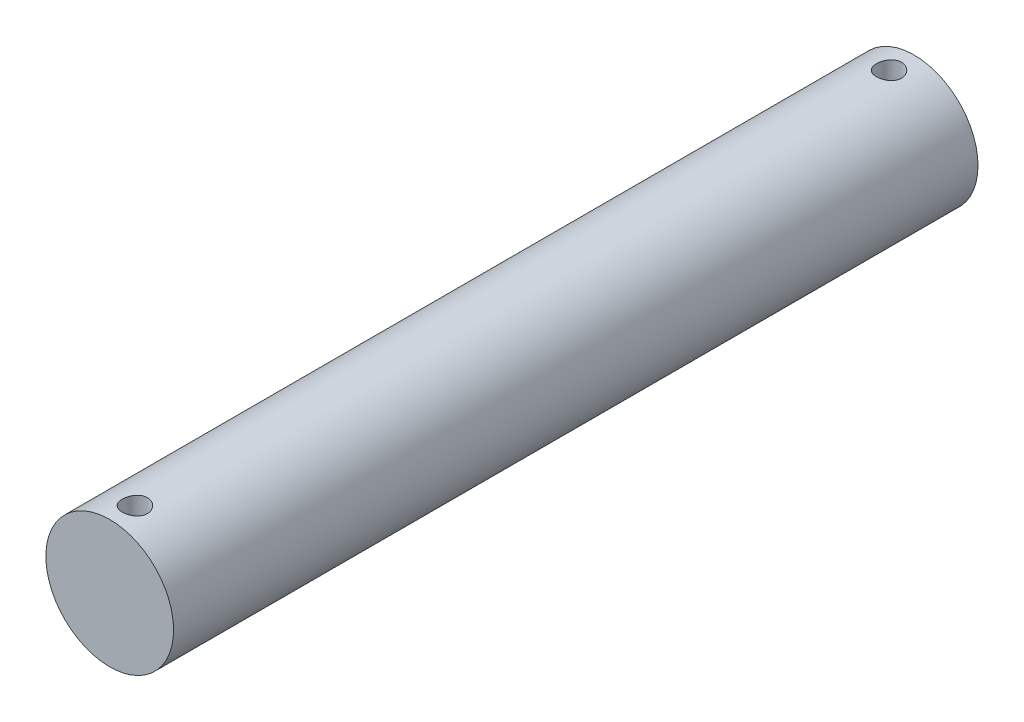
ISO-10303-21;
HEADER;
FILE_DESCRIPTION(('STEP AP214'),'2;1');
FILE_NAME('part.step','',(''),(''),'','','');
FILE_SCHEMA(('AUTOMOTIVE_DESIGN { 1 0 10303 214 1 1 1 1 }'));
ENDSEC;
DATA;
#1=APPLICATION_CONTEXT('core data for automotive mechanical design processes');
#2=APPLICATION_PROTOCOL_DEFINITION('international standard','automotive_design',2000,#1);
#3=PRODUCT_CONTEXT('',#1,'mechanical');
#4=PRODUCT('Part','Part','',(#3));
#5=PRODUCT_RELATED_PRODUCT_CATEGORY('part','',(#4));
#6=PRODUCT_DEFINITION_FORMATION('','',#4);
#7=PRODUCT_DEFINITION_CONTEXT('part definition',#1,'design');
#8=PRODUCT_DEFINITION('design','',#6,#7);
#9=PRODUCT_DEFINITION_SHAPE('','',#8);
#10=(LENGTH_UNIT() NAMED_UNIT(*) SI_UNIT(.MILLI.,.METRE.));
#11=(NAMED_UNIT(*) PLANE_ANGLE_UNIT() SI_UNIT($,.RADIAN.));
#12=(NAMED_UNIT(*) SI_UNIT($,.STERADIAN.) SOLID_ANGLE_UNIT());
#13=UNCERTAINTY_MEASURE_WITH_UNIT(LENGTH_MEASURE(1.E-05),#10,'distance_accuracy_value','');
#14=(GEOMETRIC_REPRESENTATION_CONTEXT(3) GLOBAL_UNCERTAINTY_ASSIGNED_CONTEXT((#13)) GLOBAL_UNIT_ASSIGNED_CONTEXT((#10,
#11,#12)) REPRESENTATION_CONTEXT('',''));
#15=CARTESIAN_POINT('',(0.,0.,0.));
#16=DIRECTION('',(0.,0.,1.));
#17=DIRECTION('',(1.,0.,0.));
#18=AXIS2_PLACEMENT_3D('',#15,#16,#17);
#19=CARTESIAN_POINT('',(0.,0.,40.));
#20=DIRECTION('',(0.,0.,-1.));
#21=DIRECTION('',(-1.,0.,0.));
#22=AXIS2_PLACEMENT_3D('',#19,#20,#21);
#23=CYLINDRICAL_SURFACE('',#22,6.35);
#24=CARTESIAN_POINT('',(0.,-6.35,-36.25));
#25=CARTESIAN_POINT('',(0.0694939804326168,-6.34999872344055,-36.2500025830285));
#26=CARTESIAN_POINT('',(0.139020856807098,-6.34884746695947,-36.2558148776677));
#27=CARTESIAN_POINT('',(0.276110920333324,-6.34436590183971,-36.2788929251196));
#28=CARTESIAN_POINT('',(0.343672476376258,-6.34103383426819,-36.2961679233299));
#29=CARTESIAN_POINT('',(0.474829848521739,-6.33256289060586,-36.3416182950422));
#30=CARTESIAN_POINT('',(0.538429341852971,-6.32742572017194,-36.3697833809219));
#31=CARTESIAN_POINT('',(0.659995353609192,-6.31590367713382,-36.4361842015533));
#32=CARTESIAN_POINT('',(0.717962238037104,-6.30951888568045,-36.4744192813639));
#33=CARTESIAN_POINT('',(0.827384016512087,-6.29611102614492,-36.560407543197));
#34=CARTESIAN_POINT('',(0.878754225040865,-6.28908132948856,-36.6082674663906));
#35=CARTESIAN_POINT('',(0.972791329937009,-6.2752244237706,-36.7119173479668));
#36=CARTESIAN_POINT('',(1.01545756098707,-6.26839723022205,-36.7677079120014));
#37=CARTESIAN_POINT('',(1.09123391279335,-6.25565368156531,-36.8862417926095));
#38=CARTESIAN_POINT('',(1.12425674252627,-6.24974585984846,-36.9490419110947));
#39=CARTESIAN_POINT('',(1.17924978458522,-6.23960391049848,-37.0794347079246));
#40=CARTESIAN_POINT('',(1.20122105276671,-6.23536962298579,-37.1470269277323));
#41=CARTESIAN_POINT('',(1.23321317099972,-6.22912114018685,-37.2841753722516));
#42=CARTESIAN_POINT('',(1.24338237441819,-6.22707940916392,-37.3536957111729));
#43=CARTESIAN_POINT('',(1.25194241392171,-6.22536429547634,-37.4934834758231));
#44=CARTESIAN_POINT('',(1.25033441599248,-6.22569067835976,-37.5637508269074));
#45=CARTESIAN_POINT('',(1.23550573337242,-6.22864988383405,-37.7019553364995));
#46=CARTESIAN_POINT('',(1.22245476039046,-6.23124899784788,-37.7699115334056));
#47=CARTESIAN_POINT('',(1.18537832222863,-6.23840776786276,-37.9026506171126));
#48=CARTESIAN_POINT('',(1.16135234775691,-6.24296751484584,-37.9674333564957));
#49=CARTESIAN_POINT('',(1.10284485747249,-6.25356844492134,-38.0924775953159));
#50=CARTESIAN_POINT('',(1.06829575022773,-6.25961915520019,-38.1527066279822));
#51=CARTESIAN_POINT('',(0.989770436249246,-6.27251408593659,-38.2665761388861));
#52=CARTESIAN_POINT('',(0.945793178637783,-6.27935839481092,-38.3202158816208));
#53=CARTESIAN_POINT('',(0.848749620379546,-6.29321559250291,-38.4203637831301));
#54=CARTESIAN_POINT('',(0.795538391483498,-6.30022934156696,-38.4667315011047));
#55=CARTESIAN_POINT('',(0.682019835627286,-6.31352591556468,-38.54990472923));
#56=CARTESIAN_POINT('',(0.621712423039482,-6.31980873167657,-38.5867101239778));
#57=CARTESIAN_POINT('',(0.495559855492551,-6.33095024356266,-38.6497385483793));
#58=CARTESIAN_POINT('',(0.429706667639595,-6.33580682618573,-38.6759458970876));
#59=CARTESIAN_POINT('',(0.294415437445406,-6.34353255640573,-38.7168865619969));
#60=CARTESIAN_POINT('',(0.224977816567587,-6.3464019370917,-38.7316212239129));
#61=CARTESIAN_POINT('',(0.085696020458171,-6.34979761511535,-38.7490002852713));
#62=CARTESIAN_POINT('',(0.0158767138616839,-6.35036116751766,-38.7518369388497));
#63=CARTESIAN_POINT('',(-0.123238319169051,-6.34918502460119,-38.7458566944363));
#64=CARTESIAN_POINT('',(-0.19253407386959,-6.34744545453345,-38.7370404301668));
#65=CARTESIAN_POINT('',(-0.328017411524045,-6.34188181040703,-38.7081643669562));
#66=CARTESIAN_POINT('',(-0.394226758532903,-6.3380759676032,-38.6882028622251));
#67=CARTESIAN_POINT('',(-0.522358707908789,-6.32880490671267,-38.6377100946256));
#68=CARTESIAN_POINT('',(-0.584280996267094,-6.32333956723251,-38.6071780584916));
#69=CARTESIAN_POINT('',(-0.702894389008583,-6.31126292459246,-38.5359925369076));
#70=CARTESIAN_POINT('',(-0.759514422690818,-6.30463875071603,-38.4952228586844));
#71=CARTESIAN_POINT('',(-0.865178401164783,-6.29101022941264,-38.4048753567531));
#72=CARTESIAN_POINT('',(-0.914221559867101,-6.2840058426409,-38.3552966202643));
#73=CARTESIAN_POINT('',(-1.00407868802173,-6.27028126377194,-38.2478643770842));
#74=CARTESIAN_POINT('',(-1.04476087118854,-6.26356677403919,-38.1898997900802));
#75=CARTESIAN_POINT('',(-1.11581163487925,-6.25130144140895,-38.0678467845837));
#76=CARTESIAN_POINT('',(-1.14618062108291,-6.24575055274337,-38.0037586070956));
#77=CARTESIAN_POINT('',(-1.19556121034271,-6.23648663322854,-37.8715957979547));
#78=CARTESIAN_POINT('',(-1.21463070325767,-6.23276425161642,-37.8035434825059));
#79=CARTESIAN_POINT('',(-1.24104736373124,-6.22755858712954,-37.6651197565631));
#80=CARTESIAN_POINT('',(-1.24839600622804,-6.2260750225259,-37.5947486390021));
#81=CARTESIAN_POINT('',(-1.25110911670658,-6.22553026233713,-37.45500722803));
#82=CARTESIAN_POINT('',(-1.24668173183846,-6.22642699327119,-37.3856410557011));
#83=CARTESIAN_POINT('',(-1.22642690288144,-6.23044796366243,-37.2486627850657));
#84=CARTESIAN_POINT('',(-1.21059954408837,-6.23357218645326,-37.1810506736391));
#85=CARTESIAN_POINT('',(-1.16808561930223,-6.24167758718142,-37.0496269528697));
#86=CARTESIAN_POINT('',(-1.14142381041251,-6.24665452942732,-36.9858070567493));
#87=CARTESIAN_POINT('',(-1.07802140699671,-6.25790715548942,-36.8635136103839));
#88=CARTESIAN_POINT('',(-1.04128000120944,-6.26418294383389,-36.8050404909821));
#89=CARTESIAN_POINT('',(-0.958047153780958,-6.27745535581054,-36.694062374324));
#90=CARTESIAN_POINT('',(-0.911405090098398,-6.28446214955247,-36.6416715385556));
#91=CARTESIAN_POINT('',(-0.810006714298532,-6.29833330286004,-36.5453912314673));
#92=CARTESIAN_POINT('',(-0.755248540568527,-6.30519762933471,-36.5015037159182));
#93=CARTESIAN_POINT('',(-0.638509398203907,-6.31809192156363,-36.4230591445075));
#94=CARTESIAN_POINT('',(-0.576461177409875,-6.32411277788587,-36.3886006159069));
#95=CARTESIAN_POINT('',(-0.447354677582579,-6.33455228311075,-36.3306536489711));
#96=CARTESIAN_POINT('',(-0.380301028513244,-6.33897239107068,-36.3071552150252));
#97=CARTESIAN_POINT('',(-0.260903753738923,-6.3448426925249,-36.2764034123135));
#98=CARTESIAN_POINT('',(-0.209244697378747,-6.34676546742744,-36.2665195954896));
#99=CARTESIAN_POINT('',(-0.105063344582431,-6.34934458466464,-36.2533170117537));
#100=CARTESIAN_POINT('',(-0.0525410741960249,-6.35000096514553,-36.2499980470957));
#101=CARTESIAN_POINT('',(0.,-6.35,-36.25));
#102=B_SPLINE_CURVE_WITH_KNOTS('',3,(#24,#25,#26,#27,#28,#29,#30,#31,#32,#33,#34,#35,#36,#37,
#38,#39,#40,#41,#42,#43,#44,#45,#46,#47,#48,#49,#50,#51,#52,#53,#54,#55,#56,#57,#58,#59,#60,#61,
#62,#63,#64,#65,#66,#67,#68,#69,#70,#71,#72,#73,#74,#75,#76,#77,#78,#79,#80,#81,#82,#83,#84,#85,
#86,#87,#88,#89,#90,#91,#92,#93,#94,#95,#96,#97,#98,#99,#100,#101),.UNSPECIFIED.,.T.,.F.,(4,2,2,
2,2,2,2,2,2,2,2,2,2,2,2,2,2,2,2,2,2,2,2,2,2,2,2,2,2,2,2,2,2,2,2,2,2,2,4),(0.,0.20828974718966,
0.416747697814534,0.625009202121003,0.833257164680661,1.04395644558372,1.25467182595345,
1.46723931776154,1.67978649721884,1.88963196168973,2.09945665097822,2.30622107208781,
2.51299508901675,2.7211262980827,2.92928071788109,3.14105959839086,3.35284103463858,
3.56493468769529,3.77700345899184,3.98563198908576,4.19424917376995,4.40105490064573,
4.60787575916645,4.81715935266284,5.02646464445815,5.23885147330543,5.45122994673927,
5.66251073275075,5.87376492933512,6.08131002421399,6.28885356623402,6.49592550697449,
6.70301411889162,6.91351361259455,7.12406146403359,7.33673198768616,7.5492081746515,
7.70669083222362,7.86416874604056),.UNSPECIFIED.);
#103=CARTESIAN_POINT('',(0.,-6.35,-36.25));
#104=VERTEX_POINT('',#103);
#105=EDGE_CURVE('E35',#104,#104,#102,.T.);
#106=ORIENTED_EDGE('',*,*,#105,.T.);
#107=EDGE_LOOP('',(#106));
#108=FACE_BOUND('',#107,.T.);
#109=CARTESIAN_POINT('',(0.,6.35,-36.25));
#110=CARTESIAN_POINT('',(-0.0694939804326168,6.34999872344055,-36.2500025830285));
#111=CARTESIAN_POINT('',(-0.139020856807098,6.34884746695947,-36.2558148776677));
#112=CARTESIAN_POINT('',(-0.276110920333324,6.34436590183971,-36.2788929251196));
#113=CARTESIAN_POINT('',(-0.343672476376258,6.34103383426819,-36.2961679233299));
#114=CARTESIAN_POINT('',(-0.474829848521739,6.33256289060586,-36.3416182950422));
#115=CARTESIAN_POINT('',(-0.538429341852971,6.32742572017194,-36.3697833809219));
#116=CARTESIAN_POINT('',(-0.659995353609192,6.31590367713382,-36.4361842015533));
#117=CARTESIAN_POINT('',(-0.717962238037104,6.30951888568045,-36.4744192813639));
#118=CARTESIAN_POINT('',(-0.827384016512087,6.29611102614492,-36.560407543197));
#119=CARTESIAN_POINT('',(-0.878754225040865,6.28908132948856,-36.6082674663906));
#120=CARTESIAN_POINT('',(-0.972791329937009,6.2752244237706,-36.7119173479668));
#121=CARTESIAN_POINT('',(-1.01545756098707,6.26839723022205,-36.7677079120014));
#122=CARTESIAN_POINT('',(-1.09123391279335,6.25565368156531,-36.8862417926095));
#123=CARTESIAN_POINT('',(-1.12425674252627,6.24974585984846,-36.9490419110947));
#124=CARTESIAN_POINT('',(-1.17924978458522,6.23960391049848,-37.0794347079246));
#125=CARTESIAN_POINT('',(-1.20122105276671,6.23536962298579,-37.1470269277323));
#126=CARTESIAN_POINT('',(-1.23321317099972,6.22912114018685,-37.2841753722516));
#127=CARTESIAN_POINT('',(-1.24338237441819,6.22707940916392,-37.3536957111729));
#128=CARTESIAN_POINT('',(-1.25194241392171,6.22536429547634,-37.4934834758231));
#129=CARTESIAN_POINT('',(-1.25033441599248,6.22569067835976,-37.5637508269074));
#130=CARTESIAN_POINT('',(-1.23550573337242,6.22864988383405,-37.7019553364995));
#131=CARTESIAN_POINT('',(-1.22245476039046,6.23124899784788,-37.7699115334056));
#132=CARTESIAN_POINT('',(-1.18537832222863,6.23840776786276,-37.9026506171126));
#133=CARTESIAN_POINT('',(-1.16135234775691,6.24296751484584,-37.9674333564957));
#134=CARTESIAN_POINT('',(-1.10284485747249,6.25356844492134,-38.0924775953159));
#135=CARTESIAN_POINT('',(-1.06829575022773,6.25961915520019,-38.1527066279822));
#136=CARTESIAN_POINT('',(-0.989770436249246,6.27251408593659,-38.2665761388861));
#137=CARTESIAN_POINT('',(-0.945793178637783,6.27935839481092,-38.3202158816208));
#138=CARTESIAN_POINT('',(-0.848749620379546,6.29321559250291,-38.4203637831301));
#139=CARTESIAN_POINT('',(-0.795538391483498,6.30022934156696,-38.4667315011047));
#140=CARTESIAN_POINT('',(-0.682019835627286,6.31352591556468,-38.54990472923));
#141=CARTESIAN_POINT('',(-0.621712423039482,6.31980873167657,-38.5867101239778));
#142=CARTESIAN_POINT('',(-0.495559855492551,6.33095024356266,-38.6497385483793));
#143=CARTESIAN_POINT('',(-0.429706667639595,6.33580682618573,-38.6759458970876));
#144=CARTESIAN_POINT('',(-0.294415437445406,6.34353255640573,-38.7168865619969));
#145=CARTESIAN_POINT('',(-0.224977816567587,6.3464019370917,-38.7316212239129));
#146=CARTESIAN_POINT('',(-0.085696020458171,6.34979761511535,-38.7490002852713));
#147=CARTESIAN_POINT('',(-0.0158767138616839,6.35036116751766,-38.7518369388497));
#148=CARTESIAN_POINT('',(0.123238319169051,6.34918502460119,-38.7458566944363));
#149=CARTESIAN_POINT('',(0.19253407386959,6.34744545453345,-38.7370404301668));
#150=CARTESIAN_POINT('',(0.328017411524045,6.34188181040703,-38.7081643669562));
#151=CARTESIAN_POINT('',(0.394226758532903,6.3380759676032,-38.6882028622251));
#152=CARTESIAN_POINT('',(0.522358707908789,6.32880490671267,-38.6377100946256));
#153=CARTESIAN_POINT('',(0.584280996267094,6.32333956723251,-38.6071780584916));
#154=CARTESIAN_POINT('',(0.702894389008583,6.31126292459246,-38.5359925369076));
#155=CARTESIAN_POINT('',(0.759514422690818,6.30463875071603,-38.4952228586844));
#156=CARTESIAN_POINT('',(0.865178401164783,6.29101022941264,-38.4048753567531));
#157=CARTESIAN_POINT('',(0.914221559867101,6.2840058426409,-38.3552966202643));
#158=CARTESIAN_POINT('',(1.00407868802173,6.27028126377194,-38.2478643770842));
#159=CARTESIAN_POINT('',(1.04476087118854,6.26356677403919,-38.1898997900802));
#160=CARTESIAN_POINT('',(1.11581163487925,6.25130144140895,-38.0678467845837));
#161=CARTESIAN_POINT('',(1.14618062108291,6.24575055274337,-38.0037586070956));
#162=CARTESIAN_POINT('',(1.19556121034271,6.23648663322854,-37.8715957979547));
#163=CARTESIAN_POINT('',(1.21463070325767,6.23276425161642,-37.8035434825059));
#164=CARTESIAN_POINT('',(1.24104736373124,6.22755858712954,-37.6651197565631));
#165=CARTESIAN_POINT('',(1.24839600622804,6.2260750225259,-37.5947486390021));
#166=CARTESIAN_POINT('',(1.25110911670658,6.22553026233713,-37.45500722803));
#167=CARTESIAN_POINT('',(1.24668173183846,6.22642699327119,-37.3856410557011));
#168=CARTESIAN_POINT('',(1.22642690288144,6.23044796366243,-37.2486627850657));
#169=CARTESIAN_POINT('',(1.21059954408837,6.23357218645326,-37.1810506736391));
#170=CARTESIAN_POINT('',(1.16808561930223,6.24167758718142,-37.0496269528697));
#171=CARTESIAN_POINT('',(1.14142381041251,6.24665452942732,-36.9858070567493));
#172=CARTESIAN_POINT('',(1.07802140699671,6.25790715548942,-36.8635136103839));
#173=CARTESIAN_POINT('',(1.04128000120944,6.26418294383389,-36.8050404909821));
#174=CARTESIAN_POINT('',(0.958047153780958,6.27745535581054,-36.694062374324));
#175=CARTESIAN_POINT('',(0.911405090098398,6.28446214955247,-36.6416715385556));
#176=CARTESIAN_POINT('',(0.810006714298532,6.29833330286004,-36.5453912314673));
#177=CARTESIAN_POINT('',(0.755248540568527,6.30519762933471,-36.5015037159182));
#178=CARTESIAN_POINT('',(0.638509398203907,6.31809192156363,-36.4230591445075));
#179=CARTESIAN_POINT('',(0.576461177409875,6.32411277788587,-36.3886006159069));
#180=CARTESIAN_POINT('',(0.447354677582579,6.33455228311075,-36.3306536489711));
#181=CARTESIAN_POINT('',(0.380301028513244,6.33897239107068,-36.3071552150252));
#182=CARTESIAN_POINT('',(0.260903753738923,6.3448426925249,-36.2764034123135));
#183=CARTESIAN_POINT('',(0.209244697378747,6.34676546742744,-36.2665195954896));
#184=CARTESIAN_POINT('',(0.105063344582431,6.34934458466464,-36.2533170117537));
#185=CARTESIAN_POINT('',(0.0525410741960249,6.35000096514553,-36.2499980470957));
#186=CARTESIAN_POINT('',(0.,6.35,-36.25));
#187=B_SPLINE_CURVE_WITH_KNOTS('',3,(#109,#110,#111,#112,#113,#114,#115,#116,#117,#118,#119,
#120,#121,#122,#123,#124,#125,#126,#127,#128,#129,#130,#131,#132,#133,#134,#135,#136,#137,#138,
#139,#140,#141,#142,#143,#144,#145,#146,#147,#148,#149,#150,#151,#152,#153,#154,#155,#156,#157,
#158,#159,#160,#161,#162,#163,#164,#165,#166,#167,#168,#169,#170,#171,#172,#173,#174,#175,#176,
#177,#178,#179,#180,#181,#182,#183,#184,#185,#186),.UNSPECIFIED.,.T.,.F.,(4,2,2,2,2,2,2,2,2,2,2,
2,2,2,2,2,2,2,2,2,2,2,2,2,2,2,2,2,2,2,2,2,2,2,2,2,2,2,4),(0.,0.20828974718966,0.416747697814534,
0.625009202121003,0.833257164680661,1.04395644558372,1.25467182595345,1.46723931776154,
1.67978649721884,1.88963196168973,2.09945665097822,2.30622107208781,2.51299508901675,
2.7211262980827,2.92928071788109,3.14105959839086,3.35284103463858,3.56493468769529,
3.77700345899184,3.98563198908576,4.19424917376995,4.40105490064573,4.60787575916645,
4.81715935266284,5.02646464445815,5.23885147330543,5.45122994673927,5.66251073275075,
5.87376492933512,6.08131002421399,6.28885356623402,6.49592550697449,6.70301411889162,
6.91351361259455,7.12406146403359,7.33673198768616,7.5492081746515,7.70669083222362,
7.86416874604056),.UNSPECIFIED.);
#188=CARTESIAN_POINT('',(0.,6.35,-36.25));
#189=VERTEX_POINT('',#188);
#190=EDGE_CURVE('E87',#189,#189,#187,.T.);
#191=ORIENTED_EDGE('',*,*,#190,.T.);
#192=EDGE_LOOP('',(#191));
#193=FACE_BOUND('',#192,.T.);
#194=CARTESIAN_POINT('',(0.,-6.35,38.75));
#195=CARTESIAN_POINT('',(0.0694939804326168,-6.34999872344055,38.7499974169715));
#196=CARTESIAN_POINT('',(0.139020856807098,-6.34884746695947,38.7441851223323));
#197=CARTESIAN_POINT('',(0.276110920333324,-6.34436590183971,38.7211070748804));
#198=CARTESIAN_POINT('',(0.343672476376258,-6.34103383426819,38.7038320766701));
#199=CARTESIAN_POINT('',(0.474829848521739,-6.33256289060586,38.6583817049578));
#200=CARTESIAN_POINT('',(0.538429341852971,-6.32742572017194,38.6302166190781));
#201=CARTESIAN_POINT('',(0.659995353609192,-6.31590367713382,38.5638157984467));
#202=CARTESIAN_POINT('',(0.717962238037104,-6.30951888568045,38.5255807186361));
#203=CARTESIAN_POINT('',(0.827384016512087,-6.29611102614492,38.439592456803));
#204=CARTESIAN_POINT('',(0.878754225040866,-6.28908132948856,38.3917325336094));
#205=CARTESIAN_POINT('',(0.97279132993701,-6.2752244237706,38.2880826520332));
#206=CARTESIAN_POINT('',(1.01545756098707,-6.26839723022205,38.2322920879986));
#207=CARTESIAN_POINT('',(1.09123391279336,-6.25565368156531,38.1137582073905));
#208=CARTESIAN_POINT('',(1.12425674252627,-6.24974585984846,38.0509580889053));
#209=CARTESIAN_POINT('',(1.17924978458522,-6.23960391049847,37.9205652920754));
#210=CARTESIAN_POINT('',(1.20122105276671,-6.23536962298579,37.8529730722677));
#211=CARTESIAN_POINT('',(1.23321317099972,-6.22912114018685,37.7158246277484));
#212=CARTESIAN_POINT('',(1.24338237441819,-6.22707940916393,37.6463042888271));
#213=CARTESIAN_POINT('',(1.25194241392171,-6.22536429547634,37.5065165241769));
#214=CARTESIAN_POINT('',(1.25033441599248,-6.22569067835976,37.4362491730926));
#215=CARTESIAN_POINT('',(1.23550573337242,-6.22864988383405,37.2980446635005));
#216=CARTESIAN_POINT('',(1.22245476039046,-6.23124899784788,37.2300884665944));
#217=CARTESIAN_POINT('',(1.18537832222863,-6.23840776786276,37.0973493828874));
#218=CARTESIAN_POINT('',(1.16135234775691,-6.24296751484584,37.0325666435043));
#219=CARTESIAN_POINT('',(1.10284485747249,-6.25356844492134,36.9075224046841));
#220=CARTESIAN_POINT('',(1.06829575022773,-6.25961915520019,36.8472933720178));
#221=CARTESIAN_POINT('',(0.989770436249246,-6.27251408593659,36.7334238611139));
#222=CARTESIAN_POINT('',(0.945793178637784,-6.27935839481092,36.6797841183792));
#223=CARTESIAN_POINT('',(0.848749620379547,-6.29321559250291,36.5796362168699));
#224=CARTESIAN_POINT('',(0.795538391483499,-6.30022934156696,36.5332684988953));
#225=CARTESIAN_POINT('',(0.682019835627288,-6.31352591556468,36.45009527077));
#226=CARTESIAN_POINT('',(0.621712423039483,-6.31980873167657,36.4132898760222));
#227=CARTESIAN_POINT('',(0.495559855492552,-6.33095024356266,36.3502614516207));
#228=CARTESIAN_POINT('',(0.429706667639597,-6.33580682618573,36.3240541029124));
#229=CARTESIAN_POINT('',(0.294415437445408,-6.34353255640573,36.2831134380031));
#230=CARTESIAN_POINT('',(0.224977816567589,-6.3464019370917,36.2683787760871));
#231=CARTESIAN_POINT('',(0.0856960204581722,-6.34979761511535,36.2509997147287));
#232=CARTESIAN_POINT('',(0.015876713861685,-6.35036116751766,36.2481630611503));
#233=CARTESIAN_POINT('',(-0.12323831916905,-6.34918502460119,36.2541433055637));
#234=CARTESIAN_POINT('',(-0.19253407386959,-6.34744545453345,36.2629595698332));
#235=CARTESIAN_POINT('',(-0.328017411524043,-6.34188181040703,36.2918356330438));
#236=CARTESIAN_POINT('',(-0.394226758532901,-6.3380759676032,36.3117971377749));
#237=CARTESIAN_POINT('',(-0.522358707908788,-6.32880490671267,36.3622899053744));
#238=CARTESIAN_POINT('',(-0.584280996267095,-6.32333956723251,36.3928219415084));
#239=CARTESIAN_POINT('',(-0.702894389008583,-6.31126292459246,36.4640074630924));
#240=CARTESIAN_POINT('',(-0.759514422690815,-6.30463875071603,36.5047771413156));
#241=CARTESIAN_POINT('',(-0.86517840116478,-6.29101022941264,36.5951246432468));
#242=CARTESIAN_POINT('',(-0.914221559867101,-6.2840058426409,36.6447033797357));
#243=CARTESIAN_POINT('',(-1.00407868802173,-6.27028126377194,36.7521356229158));
#244=CARTESIAN_POINT('',(-1.04476087118854,-6.26356677403919,36.8101002099198));
#245=CARTESIAN_POINT('',(-1.11581163487925,-6.25130144140895,36.9321532154163));
#246=CARTESIAN_POINT('',(-1.14618062108292,-6.24575055274337,36.9962413929043));
#247=CARTESIAN_POINT('',(-1.19556121034271,-6.23648663322854,37.1284042020453));
#248=CARTESIAN_POINT('',(-1.21463070325768,-6.23276425161642,37.1964565174941));
#249=CARTESIAN_POINT('',(-1.24104736373124,-6.22755858712954,37.3348802434369));
#250=CARTESIAN_POINT('',(-1.24839600622804,-6.2260750225259,37.4052513609979));
#251=CARTESIAN_POINT('',(-1.25110911670658,-6.22553026233713,37.54499277197));
#252=CARTESIAN_POINT('',(-1.24668173183846,-6.22642699327119,37.6143589442989));
#253=CARTESIAN_POINT('',(-1.22642690288144,-6.23044796366243,37.7513372149343));
#254=CARTESIAN_POINT('',(-1.21059954408838,-6.23357218645326,37.8189493263609));
#255=CARTESIAN_POINT('',(-1.16808561930223,-6.24167758718142,37.9503730471303));
#256=CARTESIAN_POINT('',(-1.14142381041251,-6.24665452942732,38.0141929432507));
#257=CARTESIAN_POINT('',(-1.07802140699671,-6.25790715548942,38.1364863896161));
#258=CARTESIAN_POINT('',(-1.04128000120944,-6.26418294383389,38.1949595090179));
#259=CARTESIAN_POINT('',(-0.958047153780959,-6.27745535581054,38.305937625676));
#260=CARTESIAN_POINT('',(-0.911405090098399,-6.28446214955247,38.3583284614444));
#261=CARTESIAN_POINT('',(-0.810006714298533,-6.29833330286004,38.4546087685327));
#262=CARTESIAN_POINT('',(-0.755248540568528,-6.30519762933471,38.4984962840818));
#263=CARTESIAN_POINT('',(-0.638509398203908,-6.31809192156363,38.5769408554925));
#264=CARTESIAN_POINT('',(-0.576461177409876,-6.32411277788587,38.6113993840931));
#265=CARTESIAN_POINT('',(-0.44735467758258,-6.33455228311075,38.6693463510289));
#266=CARTESIAN_POINT('',(-0.380301028513245,-6.33897239107068,38.6928447849748));
#267=CARTESIAN_POINT('',(-0.260903753738924,-6.3448426925249,38.7235965876865));
#268=CARTESIAN_POINT('',(-0.209244697378748,-6.34676546742744,38.7334804045104));
#269=CARTESIAN_POINT('',(-0.105063344582432,-6.34934458466464,38.7466829882463));
#270=CARTESIAN_POINT('',(-0.0525410741960251,-6.35000096514553,38.7500019529043));
#271=CARTESIAN_POINT('',(0.,-6.35,38.75));
#272=B_SPLINE_CURVE_WITH_KNOTS('',3,(#194,#195,#196,#197,#198,#199,#200,#201,#202,#203,#204,
#205,#206,#207,#208,#209,#210,#211,#212,#213,#214,#215,#216,#217,#218,#219,#220,#221,#222,#223,
#224,#225,#226,#227,#228,#229,#230,#231,#232,#233,#234,#235,#236,#237,#238,#239,#240,#241,#242,
#243,#244,#245,#246,#247,#248,#249,#250,#251,#252,#253,#254,#255,#256,#257,#258,#259,#260,#261,
#262,#263,#264,#265,#266,#267,#268,#269,#270,#271),.UNSPECIFIED.,.T.,.F.,(4,2,2,2,2,2,2,2,2,2,2,
2,2,2,2,2,2,2,2,2,2,2,2,2,2,2,2,2,2,2,2,2,2,2,2,2,2,2,4),(0.,0.20828974718966,0.416747697814533,
0.625009202121004,0.833257164680661,1.04395644558373,1.25467182595345,1.46723931776154,
1.67978649721885,1.88963196168973,2.09945665097822,2.30622107208781,2.51299508901675,
2.7211262980827,2.92928071788109,3.14105959839086,3.35284103463858,3.56493468769529,
3.77700345899184,3.98563198908576,4.19424917376995,4.40105490064573,4.60787575916645,
4.81715935266284,5.02646464445816,5.23885147330544,5.45122994673928,5.66251073275075,
5.87376492933513,6.081310024214,6.28885356623403,6.49592550697449,6.70301411889162,
6.91351361259455,7.1240614640336,7.33673198768617,7.5492081746515,7.70669083222363,
7.86416874604056),.UNSPECIFIED.);
#273=CARTESIAN_POINT('',(0.,-6.35,38.75));
#274=VERTEX_POINT('',#273);
#275=EDGE_CURVE('E57',#274,#274,#272,.T.);
#276=ORIENTED_EDGE('',*,*,#275,.T.);
#277=EDGE_LOOP('',(#276));
#278=FACE_BOUND('',#277,.T.);
#279=CARTESIAN_POINT('',(0.,6.35,38.75));
#280=CARTESIAN_POINT('',(-0.0694939804326168,6.34999872344055,38.7499974169715));
#281=CARTESIAN_POINT('',(-0.139020856807098,6.34884746695947,38.7441851223323));
#282=CARTESIAN_POINT('',(-0.276110920333324,6.34436590183971,38.7211070748804));
#283=CARTESIAN_POINT('',(-0.343672476376258,6.34103383426819,38.7038320766701));
#284=CARTESIAN_POINT('',(-0.474829848521739,6.33256289060586,38.6583817049578));
#285=CARTESIAN_POINT('',(-0.538429341852971,6.32742572017194,38.6302166190781));
#286=CARTESIAN_POINT('',(-0.659995353609192,6.31590367713382,38.5638157984467));
#287=CARTESIAN_POINT('',(-0.717962238037104,6.30951888568045,38.5255807186361));
#288=CARTESIAN_POINT('',(-0.827384016512087,6.29611102614492,38.439592456803));
#289=CARTESIAN_POINT('',(-0.878754225040866,6.28908132948856,38.3917325336094));
#290=CARTESIAN_POINT('',(-0.97279132993701,6.2752244237706,38.2880826520332));
#291=CARTESIAN_POINT('',(-1.01545756098707,6.26839723022205,38.2322920879986));
#292=CARTESIAN_POINT('',(-1.09123391279336,6.25565368156531,38.1137582073905));
#293=CARTESIAN_POINT('',(-1.12425674252627,6.24974585984846,38.0509580889053));
#294=CARTESIAN_POINT('',(-1.17924978458522,6.23960391049847,37.9205652920754));
#295=CARTESIAN_POINT('',(-1.20122105276671,6.23536962298579,37.8529730722677));
#296=CARTESIAN_POINT('',(-1.23321317099972,6.22912114018685,37.7158246277484));
#297=CARTESIAN_POINT('',(-1.24338237441819,6.22707940916393,37.6463042888271));
#298=CARTESIAN_POINT('',(-1.25194241392171,6.22536429547634,37.5065165241769));
#299=CARTESIAN_POINT('',(-1.25033441599248,6.22569067835976,37.4362491730926));
#300=CARTESIAN_POINT('',(-1.23550573337242,6.22864988383405,37.2980446635005));
#301=CARTESIAN_POINT('',(-1.22245476039046,6.23124899784788,37.2300884665944));
#302=CARTESIAN_POINT('',(-1.18537832222863,6.23840776786276,37.0973493828874));
#303=CARTESIAN_POINT('',(-1.16135234775691,6.24296751484584,37.0325666435043));
#304=CARTESIAN_POINT('',(-1.10284485747249,6.25356844492134,36.9075224046841));
#305=CARTESIAN_POINT('',(-1.06829575022773,6.25961915520019,36.8472933720178));
#306=CARTESIAN_POINT('',(-0.989770436249246,6.27251408593659,36.7334238611139));
#307=CARTESIAN_POINT('',(-0.945793178637784,6.27935839481092,36.6797841183792));
#308=CARTESIAN_POINT('',(-0.848749620379547,6.29321559250291,36.5796362168699));
#309=CARTESIAN_POINT('',(-0.795538391483499,6.30022934156696,36.5332684988953));
#310=CARTESIAN_POINT('',(-0.682019835627288,6.31352591556468,36.45009527077));
#311=CARTESIAN_POINT('',(-0.621712423039483,6.31980873167657,36.4132898760222));
#312=CARTESIAN_POINT('',(-0.495559855492552,6.33095024356266,36.3502614516207));
#313=CARTESIAN_POINT('',(-0.429706667639597,6.33580682618573,36.3240541029124));
#314=CARTESIAN_POINT('',(-0.294415437445408,6.34353255640573,36.2831134380031));
#315=CARTESIAN_POINT('',(-0.224977816567589,6.3464019370917,36.2683787760871));
#316=CARTESIAN_POINT('',(-0.0856960204581722,6.34979761511535,36.2509997147287));
#317=CARTESIAN_POINT('',(-0.015876713861685,6.35036116751766,36.2481630611503));
#318=CARTESIAN_POINT('',(0.12323831916905,6.34918502460119,36.2541433055637));
#319=CARTESIAN_POINT('',(0.19253407386959,6.34744545453345,36.2629595698332));
#320=CARTESIAN_POINT('',(0.328017411524043,6.34188181040703,36.2918356330438));
#321=CARTESIAN_POINT('',(0.394226758532901,6.3380759676032,36.3117971377749));
#322=CARTESIAN_POINT('',(0.522358707908788,6.32880490671267,36.3622899053744));
#323=CARTESIAN_POINT('',(0.584280996267095,6.32333956723251,36.3928219415084));
#324=CARTESIAN_POINT('',(0.702894389008583,6.31126292459246,36.4640074630924));
#325=CARTESIAN_POINT('',(0.759514422690815,6.30463875071603,36.5047771413156));
#326=CARTESIAN_POINT('',(0.86517840116478,6.29101022941264,36.5951246432468));
#327=CARTESIAN_POINT('',(0.914221559867101,6.2840058426409,36.6447033797357));
#328=CARTESIAN_POINT('',(1.00407868802173,6.27028126377194,36.7521356229158));
#329=CARTESIAN_POINT('',(1.04476087118854,6.26356677403919,36.8101002099198));
#330=CARTESIAN_POINT('',(1.11581163487925,6.25130144140895,36.9321532154163));
#331=CARTESIAN_POINT('',(1.14618062108292,6.24575055274337,36.9962413929043));
#332=CARTESIAN_POINT('',(1.19556121034271,6.23648663322854,37.1284042020453));
#333=CARTESIAN_POINT('',(1.21463070325768,6.23276425161642,37.1964565174941));
#334=CARTESIAN_POINT('',(1.24104736373124,6.22755858712954,37.3348802434369));
#335=CARTESIAN_POINT('',(1.24839600622804,6.2260750225259,37.4052513609979));
#336=CARTESIAN_POINT('',(1.25110911670658,6.22553026233713,37.54499277197));
#337=CARTESIAN_POINT('',(1.24668173183846,6.22642699327119,37.6143589442989));
#338=CARTESIAN_POINT('',(1.22642690288144,6.23044796366243,37.7513372149343));
#339=CARTESIAN_POINT('',(1.21059954408838,6.23357218645326,37.8189493263609));
#340=CARTESIAN_POINT('',(1.16808561930223,6.24167758718142,37.9503730471303));
#341=CARTESIAN_POINT('',(1.14142381041251,6.24665452942732,38.0141929432507));
#342=CARTESIAN_POINT('',(1.07802140699671,6.25790715548942,38.1364863896161));
#343=CARTESIAN_POINT('',(1.04128000120944,6.26418294383389,38.1949595090179));
#344=CARTESIAN_POINT('',(0.958047153780959,6.27745535581054,38.305937625676));
#345=CARTESIAN_POINT('',(0.911405090098399,6.28446214955247,38.3583284614444));
#346=CARTESIAN_POINT('',(0.810006714298533,6.29833330286004,38.4546087685327));
#347=CARTESIAN_POINT('',(0.755248540568528,6.30519762933471,38.4984962840818));
#348=CARTESIAN_POINT('',(0.638509398203908,6.31809192156363,38.5769408554925));
#349=CARTESIAN_POINT('',(0.576461177409876,6.32411277788587,38.6113993840931));
#350=CARTESIAN_POINT('',(0.44735467758258,6.33455228311075,38.6693463510289));
#351=CARTESIAN_POINT('',(0.380301028513245,6.33897239107068,38.6928447849748));
#352=CARTESIAN_POINT('',(0.260903753738924,6.3448426925249,38.7235965876865));
#353=CARTESIAN_POINT('',(0.209244697378748,6.34676546742744,38.7334804045104));
#354=CARTESIAN_POINT('',(0.105063344582432,6.34934458466464,38.7466829882463));
#355=CARTESIAN_POINT('',(0.0525410741960251,6.35000096514553,38.7500019529043));
#356=CARTESIAN_POINT('',(0.,6.35,38.75));
#357=B_SPLINE_CURVE_WITH_KNOTS('',3,(#279,#280,#281,#282,#283,#284,#285,#286,#287,#288,#289,
#290,#291,#292,#293,#294,#295,#296,#297,#298,#299,#300,#301,#302,#303,#304,#305,#306,#307,#308,
#309,#310,#311,#312,#313,#314,#315,#316,#317,#318,#319,#320,#321,#322,#323,#324,#325,#326,#327,
#328,#329,#330,#331,#332,#333,#334,#335,#336,#337,#338,#339,#340,#341,#342,#343,#344,#345,#346,
#347,#348,#349,#350,#351,#352,#353,#354,#355,#356),.UNSPECIFIED.,.T.,.F.,(4,2,2,2,2,2,2,2,2,2,2,
2,2,2,2,2,2,2,2,2,2,2,2,2,2,2,2,2,2,2,2,2,2,2,2,2,2,2,4),(0.,0.20828974718966,0.416747697814533,
0.625009202121004,0.833257164680661,1.04395644558373,1.25467182595345,1.46723931776154,
1.67978649721885,1.88963196168973,2.09945665097822,2.30622107208781,2.51299508901675,
2.7211262980827,2.92928071788109,3.14105959839086,3.35284103463858,3.56493468769529,
3.77700345899184,3.98563198908576,4.19424917376995,4.40105490064573,4.60787575916645,
4.81715935266284,5.02646464445816,5.23885147330544,5.45122994673928,5.66251073275075,
5.87376492933513,6.081310024214,6.28885356623403,6.49592550697449,6.70301411889162,
6.91351361259455,7.1240614640336,7.33673198768617,7.5492081746515,7.70669083222363,
7.86416874604056),.UNSPECIFIED.);
#358=CARTESIAN_POINT('',(0.,6.35,38.75));
#359=VERTEX_POINT('',#358);
#360=EDGE_CURVE('E50',#359,#359,#357,.T.);
#361=ORIENTED_EDGE('',*,*,#360,.T.);
#362=EDGE_LOOP('',(#361));
#363=FACE_BOUND('',#362,.T.);
#364=CARTESIAN_POINT('',(0.,0.,40.));
#365=DIRECTION('',(0.,0.,1.));
#366=DIRECTION('',(1.,0.,0.));
#367=AXIS2_PLACEMENT_3D('',#364,#365,#366);
#368=CIRCLE('',#367,6.35);
#369=CARTESIAN_POINT('',(6.35,0.,40.));
#370=VERTEX_POINT('',#369);
#371=EDGE_CURVE('E10',#370,#370,#368,.T.);
#372=ORIENTED_EDGE('',*,*,#371,.F.);
#373=EDGE_LOOP('',(#372));
#374=FACE_BOUND('',#373,.T.);
#375=CARTESIAN_POINT('',(0.,0.,-40.));
#376=DIRECTION('',(0.,0.,1.));
#377=DIRECTION('',(1.,0.,0.));
#378=AXIS2_PLACEMENT_3D('',#375,#376,#377);
#379=CIRCLE('',#378,6.35);
#380=CARTESIAN_POINT('',(6.35,0.,-40.));
#381=VERTEX_POINT('',#380);
#382=EDGE_CURVE('E43',#381,#381,#379,.T.);
#383=ORIENTED_EDGE('',*,*,#382,.T.);
#384=EDGE_LOOP('',(#383));
#385=FACE_BOUND('',#384,.T.);
#386=ADVANCED_FACE('F31',(#108,#193,#278,#363,#374,#385),#23,.T.);
#387=CARTESIAN_POINT('',(0.,0.,40.));
#388=DIRECTION('',(0.,0.,1.));
#389=DIRECTION('',(1.,0.,0.));
#390=AXIS2_PLACEMENT_3D('',#387,#388,#389);
#391=PLANE('',#390);
#392=ORIENTED_EDGE('',*,*,#371,.T.);
#393=EDGE_LOOP('',(#392));
#394=FACE_BOUND('',#393,.T.);
#395=ADVANCED_FACE('F69',(#394),#391,.T.);
#396=CARTESIAN_POINT('',(0.,0.,-40.));
#397=DIRECTION('',(0.,0.,1.));
#398=DIRECTION('',(1.,0.,0.));
#399=AXIS2_PLACEMENT_3D('',#396,#397,#398);
#400=PLANE('',#399);
#401=ORIENTED_EDGE('',*,*,#382,.F.);
#402=EDGE_LOOP('',(#401));
#403=FACE_BOUND('',#402,.T.);
#404=ADVANCED_FACE('F66',(#403),#400,.F.);
#405=CARTESIAN_POINT('',(0.,-25.,37.5));
#406=DIRECTION('',(0.,1.,0.));
#407=DIRECTION('',(0.,0.,1.));
#408=AXIS2_PLACEMENT_3D('',#405,#406,#407);
#409=CYLINDRICAL_SURFACE('',#408,1.25);
#410=ORIENTED_EDGE('',*,*,#360,.F.);
#411=EDGE_LOOP('',(#410));
#412=FACE_BOUND('',#411,.T.);
#413=ORIENTED_EDGE('',*,*,#275,.F.);
#414=EDGE_LOOP('',(#413));
#415=FACE_BOUND('',#414,.T.);
#416=ADVANCED_FACE('F61',(#412,#415),#409,.F.);
#417=CARTESIAN_POINT('',(0.,-25.,-37.5));
#418=DIRECTION('',(0.,1.,0.));
#419=DIRECTION('',(0.,0.,1.));
#420=AXIS2_PLACEMENT_3D('',#417,#418,#419);
#421=CYLINDRICAL_SURFACE('',#420,1.25);
#422=ORIENTED_EDGE('',*,*,#190,.F.);
#423=EDGE_LOOP('',(#422));
#424=FACE_BOUND('',#423,.T.);
#425=ORIENTED_EDGE('',*,*,#105,.F.);
#426=EDGE_LOOP('',(#425));
#427=FACE_BOUND('',#426,.T.);
#428=ADVANCED_FACE('F65',(#424,#427),#421,.F.);
#429=CLOSED_SHELL('',(#386,#395,#404,#416,#428));
#430=MANIFOLD_SOLID_BREP('B2',#429);
#431=ADVANCED_BREP_SHAPE_REPRESENTATION('',(#18,#430),#14);
#432=SHAPE_DEFINITION_REPRESENTATION(#9,#431);
ENDSEC;
END-ISO-10303-21;
